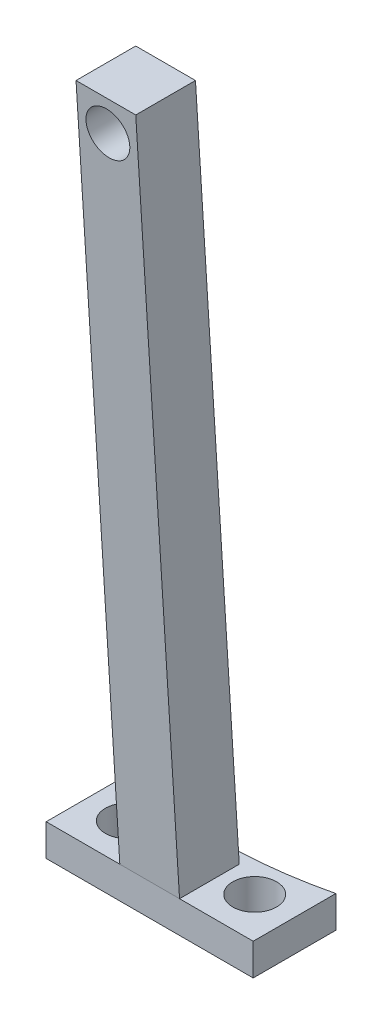
ISO-10303-21;
HEADER;
FILE_DESCRIPTION(('STEP AP214'),'2;1');
FILE_NAME('part.step','',(''),(''),'','','');
FILE_SCHEMA(('AUTOMOTIVE_DESIGN { 1 0 10303 214 1 1 1 1 }'));
ENDSEC;
DATA;
#1=APPLICATION_CONTEXT('core data for automotive mechanical design processes');
#2=APPLICATION_PROTOCOL_DEFINITION('international standard','automotive_design',2000,#1);
#3=PRODUCT_CONTEXT('',#1,'mechanical');
#4=PRODUCT('Part','Part','',(#3));
#5=PRODUCT_RELATED_PRODUCT_CATEGORY('part','',(#4));
#6=PRODUCT_DEFINITION_FORMATION('','',#4);
#7=PRODUCT_DEFINITION_CONTEXT('part definition',#1,'design');
#8=PRODUCT_DEFINITION('design','',#6,#7);
#9=PRODUCT_DEFINITION_SHAPE('','',#8);
#10=(LENGTH_UNIT() NAMED_UNIT(*) SI_UNIT(.MILLI.,.METRE.));
#11=(NAMED_UNIT(*) PLANE_ANGLE_UNIT() SI_UNIT($,.RADIAN.));
#12=(NAMED_UNIT(*) SI_UNIT($,.STERADIAN.) SOLID_ANGLE_UNIT());
#13=UNCERTAINTY_MEASURE_WITH_UNIT(LENGTH_MEASURE(1.E-05),#10,'distance_accuracy_value','');
#14=(GEOMETRIC_REPRESENTATION_CONTEXT(3) GLOBAL_UNCERTAINTY_ASSIGNED_CONTEXT((#13)) GLOBAL_UNIT_ASSIGNED_CONTEXT((#10,
#11,#12)) REPRESENTATION_CONTEXT('',''));
#15=CARTESIAN_POINT('',(0.,0.,0.));
#16=DIRECTION('',(0.,0.,1.));
#17=DIRECTION('',(1.,0.,0.));
#18=AXIS2_PLACEMENT_3D('',#15,#16,#17);
#19=CARTESIAN_POINT('',(6.5,2.,0.));
#20=DIRECTION('',(-1.,0.,0.));
#21=DIRECTION('',(0.,0.,1.));
#22=AXIS2_PLACEMENT_3D('',#19,#20,#21);
#23=PLANE('',#22);
#24=DIRECTION('',(0.,0.,-1.));
#25=VECTOR('',#24,1.);
#26=CARTESIAN_POINT('',(6.5,0.,0.));
#27=LINE('',#26,#25);
#28=CARTESIAN_POINT('',(6.5,0.,0.));
#29=VERTEX_POINT('',#28);
#30=CARTESIAN_POINT('',(6.5,0.,-5.19));
#31=VERTEX_POINT('',#30);
#32=EDGE_CURVE('E175',#29,#31,#27,.T.);
#33=ORIENTED_EDGE('',*,*,#32,.T.);
#34=DIRECTION('',(0.,-1.,0.));
#35=VECTOR('',#34,1.);
#36=CARTESIAN_POINT('',(6.5,2.,-5.19));
#37=LINE('',#36,#35);
#38=CARTESIAN_POINT('',(6.5,2.,-5.19));
#39=VERTEX_POINT('',#38);
#40=EDGE_CURVE('E12',#39,#31,#37,.T.);
#41=ORIENTED_EDGE('',*,*,#40,.F.);
#42=DIRECTION('',(0.,0.,-1.));
#43=VECTOR('',#42,1.);
#44=CARTESIAN_POINT('',(6.5,2.,0.));
#45=LINE('',#44,#43);
#46=CARTESIAN_POINT('',(6.5,2.,0.));
#47=VERTEX_POINT('',#46);
#48=EDGE_CURVE('E190',#47,#39,#45,.T.);
#49=ORIENTED_EDGE('',*,*,#48,.F.);
#50=DIRECTION('',(0.,-1.,0.));
#51=VECTOR('',#50,1.);
#52=CARTESIAN_POINT('',(6.5,2.,0.));
#53=LINE('',#52,#51);
#54=EDGE_CURVE('E191',#47,#29,#53,.T.);
#55=ORIENTED_EDGE('',*,*,#54,.T.);
#56=EDGE_LOOP('',(#33,#41,#49,#55));
#57=FACE_BOUND('',#56,.T.);
#58=ADVANCED_FACE('F53',(#57),#23,.F.);
#59=CARTESIAN_POINT('',(6.5,2.,-5.19));
#60=CARTESIAN_POINT('',(0.,2.,-3.63));
#61=CARTESIAN_POINT('',(-6.5,2.,-5.19));
#62=B_SPLINE_CURVE_WITH_KNOTS('',2,(#59,#60,#61),.UNSPECIFIED.,.F.,.F.,(3,3),(0.,1.),.UNSPECIFIED.);
#63=DIRECTION('',(0.,-1.,0.));
#64=VECTOR('',#63,1.);
#65=SURFACE_OF_LINEAR_EXTRUSION('',#62,#64);
#66=CARTESIAN_POINT('',(6.5,0.,-5.19));
#67=CARTESIAN_POINT('',(0.,0.,-3.63));
#68=CARTESIAN_POINT('',(-6.5,0.,-5.19));
#69=B_SPLINE_CURVE_WITH_KNOTS('',2,(#66,#67,#68),.UNSPECIFIED.,.F.,.F.,(3,3),(0.,1.),.UNSPECIFIED.);
#70=CARTESIAN_POINT('',(-6.5,0.,-5.19));
#71=VERTEX_POINT('',#70);
#72=EDGE_CURVE('E179',#31,#71,#69,.T.);
#73=ORIENTED_EDGE('',*,*,#72,.T.);
#74=DIRECTION('',(0.,-1.,0.));
#75=VECTOR('',#74,1.);
#76=CARTESIAN_POINT('',(-6.5,2.,-5.19));
#77=LINE('',#76,#75);
#78=CARTESIAN_POINT('',(-6.5,2.,-5.19));
#79=VERTEX_POINT('',#78);
#80=EDGE_CURVE('E61',#79,#71,#77,.T.);
#81=ORIENTED_EDGE('',*,*,#80,.F.);
#82=EDGE_CURVE('E107',#39,#79,#62,.T.);
#83=ORIENTED_EDGE('',*,*,#82,.F.);
#84=ORIENTED_EDGE('',*,*,#40,.T.);
#85=EDGE_LOOP('',(#73,#81,#83,#84));
#86=FACE_BOUND('',#85,.T.);
#87=ADVANCED_FACE('F292',(#86),#65,.F.);
#88=CARTESIAN_POINT('',(-6.5,2.,0.));
#89=DIRECTION('',(1.,0.,0.));
#90=DIRECTION('',(0.,0.,-1.));
#91=AXIS2_PLACEMENT_3D('',#88,#89,#90);
#92=PLANE('',#91);
#93=DIRECTION('',(0.,0.,1.));
#94=VECTOR('',#93,1.);
#95=CARTESIAN_POINT('',(-6.5,0.,0.));
#96=LINE('',#95,#94);
#97=CARTESIAN_POINT('',(-6.5,0.,0.));
#98=VERTEX_POINT('',#97);
#99=EDGE_CURVE('E184',#71,#98,#96,.T.);
#100=ORIENTED_EDGE('',*,*,#99,.T.);
#101=DIRECTION('',(0.,-1.,0.));
#102=VECTOR('',#101,1.);
#103=CARTESIAN_POINT('',(-6.5,2.,0.));
#104=LINE('',#103,#102);
#105=CARTESIAN_POINT('',(-6.5,2.,0.));
#106=VERTEX_POINT('',#105);
#107=EDGE_CURVE('E193',#106,#98,#104,.T.);
#108=ORIENTED_EDGE('',*,*,#107,.F.);
#109=DIRECTION('',(0.,0.,1.));
#110=VECTOR('',#109,1.);
#111=CARTESIAN_POINT('',(-6.5,2.,0.));
#112=LINE('',#111,#110);
#113=EDGE_CURVE('E170',#79,#106,#112,.T.);
#114=ORIENTED_EDGE('',*,*,#113,.F.);
#115=ORIENTED_EDGE('',*,*,#80,.T.);
#116=EDGE_LOOP('',(#100,#108,#114,#115));
#117=FACE_BOUND('',#116,.T.);
#118=ADVANCED_FACE('F199',(#117),#92,.F.);
#119=CARTESIAN_POINT('',(-6.5,2.,0.));
#120=DIRECTION('',(0.,0.,-1.));
#121=DIRECTION('',(-1.,0.,0.));
#122=AXIS2_PLACEMENT_3D('',#119,#120,#121);
#123=PLANE('',#122);
#124=DIRECTION('',(1.,0.,0.));
#125=VECTOR('',#124,1.);
#126=CARTESIAN_POINT('',(-6.5,0.,0.));
#127=LINE('',#126,#125);
#128=EDGE_CURVE('E100',#98,#29,#127,.T.);
#129=ORIENTED_EDGE('',*,*,#128,.T.);
#130=ORIENTED_EDGE('',*,*,#54,.F.);
#131=DIRECTION('',(1.,0.,0.));
#132=VECTOR('',#131,1.);
#133=CARTESIAN_POINT('',(-6.5,2.,0.));
#134=LINE('',#133,#132);
#135=CARTESIAN_POINT('',(1.87499999999999,2.,0.));
#136=VERTEX_POINT('',#135);
#137=EDGE_CURVE('E78',#136,#47,#134,.T.);
#138=ORIENTED_EDGE('',*,*,#137,.F.);
#139=DIRECTION('',(1.,0.,0.));
#140=VECTOR('',#139,1.);
#141=CARTESIAN_POINT('',(-1.875,2.,0.));
#142=LINE('',#141,#140);
#143=CARTESIAN_POINT('',(-1.875,2.,0.));
#144=VERTEX_POINT('',#143);
#145=EDGE_CURVE('E153',#144,#136,#142,.T.);
#146=ORIENTED_EDGE('',*,*,#145,.F.);
#147=EDGE_CURVE('E152',#106,#144,#134,.T.);
#148=ORIENTED_EDGE('',*,*,#147,.F.);
#149=ORIENTED_EDGE('',*,*,#107,.T.);
#150=EDGE_LOOP('',(#129,#130,#138,#146,#148,#149));
#151=FACE_BOUND('',#150,.T.);
#152=ADVANCED_FACE('F207',(#151),#123,.F.);
#153=CARTESIAN_POINT('',(0.,2.,-4.41));
#154=DIRECTION('',(0.,-1.,0.));
#155=DIRECTION('',(0.,0.,-1.));
#156=AXIS2_PLACEMENT_3D('',#153,#154,#155);
#157=PLANE('',#156);
#158=CARTESIAN_POINT('',(-4.,2.,-2.595));
#159=DIRECTION('',(0.,1.,0.));
#160=DIRECTION('',(0.,0.,1.));
#161=AXIS2_PLACEMENT_3D('',#158,#159,#160);
#162=CIRCLE('',#161,1.375);
#163=CARTESIAN_POINT('',(-4.,2.,-1.22));
#164=VERTEX_POINT('',#163);
#165=EDGE_CURVE('E282',#164,#164,#162,.T.);
#166=ORIENTED_EDGE('',*,*,#165,.F.);
#167=EDGE_LOOP('',(#166));
#168=FACE_BOUND('',#167,.T.);
#169=CARTESIAN_POINT('',(4.,2.,-2.595));
#170=DIRECTION('',(0.,1.,0.));
#171=DIRECTION('',(0.,0.,1.));
#172=AXIS2_PLACEMENT_3D('',#169,#170,#171);
#173=CIRCLE('',#172,1.375);
#174=CARTESIAN_POINT('',(4.,2.,-1.22));
#175=VERTEX_POINT('',#174);
#176=EDGE_CURVE('E277',#175,#175,#173,.T.);
#177=ORIENTED_EDGE('',*,*,#176,.F.);
#178=EDGE_LOOP('',(#177));
#179=FACE_BOUND('',#178,.T.);
#180=ORIENTED_EDGE('',*,*,#147,.T.);
#181=DIRECTION('',(0.,0.,1.));
#182=VECTOR('',#181,1.);
#183=CARTESIAN_POINT('',(-1.875,2.,-3.75));
#184=LINE('',#183,#182);
#185=CARTESIAN_POINT('',(-1.875,2.,-3.75));
#186=VERTEX_POINT('',#185);
#187=EDGE_CURVE('E133',#186,#144,#184,.T.);
#188=ORIENTED_EDGE('',*,*,#187,.F.);
#189=DIRECTION('',(-1.,0.,0.));
#190=VECTOR('',#189,1.);
#191=CARTESIAN_POINT('',(-1.875,2.,-3.75));
#192=LINE('',#191,#190);
#193=CARTESIAN_POINT('',(1.875,2.,-3.75));
#194=VERTEX_POINT('',#193);
#195=EDGE_CURVE('E143',#194,#186,#192,.T.);
#196=ORIENTED_EDGE('',*,*,#195,.F.);
#197=DIRECTION('',(0.,0.,-1.));
#198=VECTOR('',#197,1.);
#199=CARTESIAN_POINT('',(1.875,2.,0.));
#200=LINE('',#199,#198);
#201=EDGE_CURVE('E147',#136,#194,#200,.T.);
#202=ORIENTED_EDGE('',*,*,#201,.F.);
#203=ORIENTED_EDGE('',*,*,#137,.T.);
#204=ORIENTED_EDGE('',*,*,#48,.T.);
#205=ORIENTED_EDGE('',*,*,#82,.T.);
#206=ORIENTED_EDGE('',*,*,#113,.T.);
#207=EDGE_LOOP('',(#180,#188,#196,#202,#203,#204,#205,#206));
#208=FACE_BOUND('',#207,.T.);
#209=ADVANCED_FACE('F150',(#168,#179,#208),#157,.F.);
#210=CARTESIAN_POINT('',(0.,0.,-4.41));
#211=DIRECTION('',(0.,-1.,0.));
#212=DIRECTION('',(0.,0.,-1.));
#213=AXIS2_PLACEMENT_3D('',#210,#211,#212);
#214=PLANE('',#213);
#215=CARTESIAN_POINT('',(-4.,0.,-2.595));
#216=DIRECTION('',(0.,1.,0.));
#217=DIRECTION('',(0.,0.,1.));
#218=AXIS2_PLACEMENT_3D('',#215,#216,#217);
#219=CIRCLE('',#218,1.375);
#220=CARTESIAN_POINT('',(-4.,0.,-1.22));
#221=VERTEX_POINT('',#220);
#222=EDGE_CURVE('E180',#221,#221,#219,.T.);
#223=ORIENTED_EDGE('',*,*,#222,.T.);
#224=EDGE_LOOP('',(#223));
#225=FACE_BOUND('',#224,.T.);
#226=CARTESIAN_POINT('',(4.,0.,-2.595));
#227=DIRECTION('',(0.,1.,0.));
#228=DIRECTION('',(0.,0.,1.));
#229=AXIS2_PLACEMENT_3D('',#226,#227,#228);
#230=CIRCLE('',#229,1.375);
#231=CARTESIAN_POINT('',(4.,0.,-1.22));
#232=VERTEX_POINT('',#231);
#233=EDGE_CURVE('E274',#232,#232,#230,.T.);
#234=ORIENTED_EDGE('',*,*,#233,.T.);
#235=EDGE_LOOP('',(#234));
#236=FACE_BOUND('',#235,.T.);
#237=ORIENTED_EDGE('',*,*,#32,.F.);
#238=ORIENTED_EDGE('',*,*,#128,.F.);
#239=ORIENTED_EDGE('',*,*,#99,.F.);
#240=ORIENTED_EDGE('',*,*,#72,.F.);
#241=EDGE_LOOP('',(#237,#238,#239,#240));
#242=FACE_BOUND('',#241,.T.);
#243=ADVANCED_FACE('F203',(#225,#236,#242),#214,.T.);
#244=CARTESIAN_POINT('',(4.,0.,-2.595));
#245=DIRECTION('',(0.,1.,0.));
#246=DIRECTION('',(0.,0.,1.));
#247=AXIS2_PLACEMENT_3D('',#244,#245,#246);
#248=CYLINDRICAL_SURFACE('',#247,1.375);
#249=ORIENTED_EDGE('',*,*,#233,.F.);
#250=EDGE_LOOP('',(#249));
#251=FACE_BOUND('',#250,.T.);
#252=ORIENTED_EDGE('',*,*,#176,.T.);
#253=EDGE_LOOP('',(#252));
#254=FACE_BOUND('',#253,.T.);
#255=ADVANCED_FACE('F301',(#251,#254),#248,.F.);
#256=CARTESIAN_POINT('',(-4.,0.,-2.595));
#257=DIRECTION('',(0.,1.,0.));
#258=DIRECTION('',(0.,0.,1.));
#259=AXIS2_PLACEMENT_3D('',#256,#257,#258);
#260=CYLINDRICAL_SURFACE('',#259,1.375);
#261=ORIENTED_EDGE('',*,*,#222,.F.);
#262=EDGE_LOOP('',(#261));
#263=FACE_BOUND('',#262,.T.);
#264=ORIENTED_EDGE('',*,*,#165,.T.);
#265=EDGE_LOOP('',(#264));
#266=FACE_BOUND('',#265,.T.);
#267=ADVANCED_FACE('F242',(#263,#266),#260,.F.);
#268=CARTESIAN_POINT('',(0.,46.,0.));
#269=DIRECTION('',(0.,1.,0.));
#270=DIRECTION('',(0.,0.,1.));
#271=AXIS2_PLACEMENT_3D('',#268,#269,#270);
#272=PLANE('',#271);
#273=DIRECTION('',(1.,0.,0.));
#274=VECTOR('',#273,1.);
#275=CARTESIAN_POINT('',(-1.875,46.,2.75));
#276=LINE('',#275,#274);
#277=CARTESIAN_POINT('',(-1.875,46.,2.75));
#278=VERTEX_POINT('',#277);
#279=CARTESIAN_POINT('',(1.875,46.,2.75));
#280=VERTEX_POINT('',#279);
#281=EDGE_CURVE('E217',#278,#280,#276,.T.);
#282=ORIENTED_EDGE('',*,*,#281,.T.);
#283=DIRECTION('',(0.,0.,-1.));
#284=VECTOR('',#283,1.);
#285=CARTESIAN_POINT('',(1.875,46.,2.75));
#286=LINE('',#285,#284);
#287=CARTESIAN_POINT('',(1.875,46.,-1.));
#288=VERTEX_POINT('',#287);
#289=EDGE_CURVE('E215',#280,#288,#286,.T.);
#290=ORIENTED_EDGE('',*,*,#289,.T.);
#291=DIRECTION('',(-1.,0.,0.));
#292=VECTOR('',#291,1.);
#293=CARTESIAN_POINT('',(-1.875,46.,-1.));
#294=LINE('',#293,#292);
#295=CARTESIAN_POINT('',(-1.875,46.,-1.));
#296=VERTEX_POINT('',#295);
#297=EDGE_CURVE('E222',#288,#296,#294,.T.);
#298=ORIENTED_EDGE('',*,*,#297,.T.);
#299=DIRECTION('',(0.,0.,1.));
#300=VECTOR('',#299,1.);
#301=CARTESIAN_POINT('',(-1.875,46.,-1.));
#302=LINE('',#301,#300);
#303=EDGE_CURVE('E135',#296,#278,#302,.T.);
#304=ORIENTED_EDGE('',*,*,#303,.T.);
#305=EDGE_LOOP('',(#282,#290,#298,#304));
#306=FACE_BOUND('',#305,.T.);
#307=ADVANCED_FACE('F221',(#306),#272,.T.);
#308=CARTESIAN_POINT('',(-1.875,0.,0.));
#309=DIRECTION('',(1.,0.,0.));
#310=DIRECTION('',(0.,0.,-1.));
#311=AXIS2_PLACEMENT_3D('',#308,#309,#310);
#312=PLANE('',#311);
#313=DIRECTION('',(0.,0.998052578482889,0.0623782861551805));
#314=VECTOR('',#313,1.);
#315=CARTESIAN_POINT('',(-1.875,2.,0.));
#316=LINE('',#315,#314);
#317=EDGE_CURVE('E139',#144,#278,#316,.T.);
#318=ORIENTED_EDGE('',*,*,#317,.T.);
#319=ORIENTED_EDGE('',*,*,#303,.F.);
#320=DIRECTION('',(0.,0.998052578482889,0.0623782861551805));
#321=VECTOR('',#320,1.);
#322=CARTESIAN_POINT('',(-1.875,2.,-3.75));
#323=LINE('',#322,#321);
#324=EDGE_CURVE('E128',#186,#296,#323,.T.);
#325=ORIENTED_EDGE('',*,*,#324,.F.);
#326=ORIENTED_EDGE('',*,*,#187,.T.);
#327=EDGE_LOOP('',(#318,#319,#325,#326));
#328=FACE_BOUND('',#327,.T.);
#329=ADVANCED_FACE('F131',(#328),#312,.F.);
#330=CARTESIAN_POINT('',(0.,0.24124513618677,-3.85992217898833));
#331=DIRECTION('',(0.,-0.0623782861551805,0.998052578482889));
#332=DIRECTION('',(0.,-0.998052578482889,-0.0623782861551805));
#333=AXIS2_PLACEMENT_3D('',#330,#331,#332);
#334=PLANE('',#333);
#335=CARTESIAN_POINT('',(0.,44.,-1.125));
#336=DIRECTION('',(0.,-0.0623782861551805,0.998052578482889));
#337=DIRECTION('',(0.,0.998052578482889,0.0623782861551805));
#338=AXIS2_PLACEMENT_3D('',#335,#336,#337);
#339=ELLIPSE('',#338,1.37768292938043,1.375);
#340=CARTESIAN_POINT('',(0.,45.375,-1.0390625));
#341=VERTEX_POINT('',#340);
#342=EDGE_CURVE('E154',#341,#341,#339,.T.);
#343=ORIENTED_EDGE('',*,*,#342,.T.);
#344=EDGE_LOOP('',(#343));
#345=FACE_BOUND('',#344,.T.);
#346=ORIENTED_EDGE('',*,*,#324,.T.);
#347=ORIENTED_EDGE('',*,*,#297,.F.);
#348=DIRECTION('',(0.,0.998052578482889,0.0623782861551805));
#349=VECTOR('',#348,1.);
#350=CARTESIAN_POINT('',(1.875,2.,-3.75));
#351=LINE('',#350,#349);
#352=EDGE_CURVE('E146',#194,#288,#351,.T.);
#353=ORIENTED_EDGE('',*,*,#352,.F.);
#354=ORIENTED_EDGE('',*,*,#195,.T.);
#355=EDGE_LOOP('',(#346,#347,#353,#354));
#356=FACE_BOUND('',#355,.T.);
#357=ADVANCED_FACE('F144',(#345,#356),#334,.F.);
#358=CARTESIAN_POINT('',(0.,0.00778210116731518,-0.124513618677043));
#359=DIRECTION('',(0.,0.0623782861551805,-0.998052578482889));
#360=DIRECTION('',(0.,0.998052578482889,0.0623782861551805));
#361=AXIS2_PLACEMENT_3D('',#358,#359,#360);
#362=PLANE('',#361);
#363=CARTESIAN_POINT('',(0.,44.,2.625));
#364=DIRECTION('',(0.,0.0623782861551805,-0.998052578482889));
#365=DIRECTION('',(0.,0.998052578482889,0.0623782861551805));
#366=AXIS2_PLACEMENT_3D('',#363,#364,#365);
#367=ELLIPSE('',#366,1.37768292938043,1.375);
#368=CARTESIAN_POINT('',(0.,45.375,2.7109375));
#369=VERTEX_POINT('',#368);
#370=EDGE_CURVE('E56',#369,#369,#367,.T.);
#371=ORIENTED_EDGE('',*,*,#370,.T.);
#372=EDGE_LOOP('',(#371));
#373=FACE_BOUND('',#372,.T.);
#374=DIRECTION('',(0.,0.998052578482889,0.0623782861551805));
#375=VECTOR('',#374,1.);
#376=CARTESIAN_POINT('',(1.875,2.,0.));
#377=LINE('',#376,#375);
#378=EDGE_CURVE('E69',#136,#280,#377,.T.);
#379=ORIENTED_EDGE('',*,*,#378,.T.);
#380=ORIENTED_EDGE('',*,*,#281,.F.);
#381=ORIENTED_EDGE('',*,*,#317,.F.);
#382=ORIENTED_EDGE('',*,*,#145,.T.);
#383=EDGE_LOOP('',(#379,#380,#381,#382));
#384=FACE_BOUND('',#383,.T.);
#385=ADVANCED_FACE('F210',(#373,#384),#362,.F.);
#386=CARTESIAN_POINT('',(1.875,0.,0.));
#387=DIRECTION('',(-1.,0.,0.));
#388=DIRECTION('',(0.,0.,1.));
#389=AXIS2_PLACEMENT_3D('',#386,#387,#388);
#390=PLANE('',#389);
#391=ORIENTED_EDGE('',*,*,#352,.T.);
#392=ORIENTED_EDGE('',*,*,#289,.F.);
#393=ORIENTED_EDGE('',*,*,#378,.F.);
#394=ORIENTED_EDGE('',*,*,#201,.T.);
#395=EDGE_LOOP('',(#391,#392,#393,#394));
#396=FACE_BOUND('',#395,.T.);
#397=ADVANCED_FACE('F213',(#396),#390,.F.);
#398=CARTESIAN_POINT('',(0.,44.,-5.19));
#399=DIRECTION('',(0.,0.,1.));
#400=DIRECTION('',(1.,0.,0.));
#401=AXIS2_PLACEMENT_3D('',#398,#399,#400);
#402=CYLINDRICAL_SURFACE('',#401,1.375);
#403=ORIENTED_EDGE('',*,*,#370,.F.);
#404=EDGE_LOOP('',(#403));
#405=FACE_BOUND('',#404,.T.);
#406=ORIENTED_EDGE('',*,*,#342,.F.);
#407=EDGE_LOOP('',(#406));
#408=FACE_BOUND('',#407,.T.);
#409=ADVANCED_FACE('F386',(#405,#408),#402,.F.);
#410=CLOSED_SHELL('',(#58,#87,#118,#152,#209,#243,#255,#267,#307,#329,#357,#385,#397,#409));
#411=MANIFOLD_SOLID_BREP('B2',#410);
#412=ADVANCED_BREP_SHAPE_REPRESENTATION('',(#18,#411),#14);
#413=SHAPE_DEFINITION_REPRESENTATION(#9,#412);
ENDSEC;
END-ISO-10303-21;
